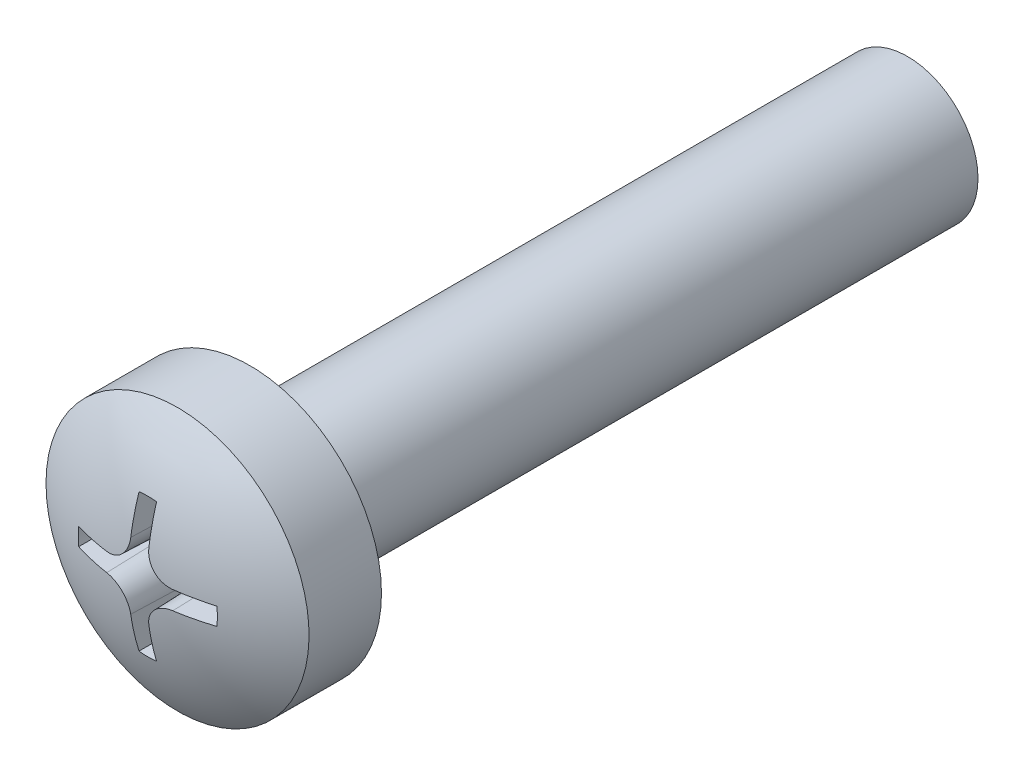
ISO-10303-21;
HEADER;
FILE_DESCRIPTION(('STEP AP214'),'2;1');
FILE_NAME('part.step','',(''),(''),'','','');
FILE_SCHEMA(('AUTOMOTIVE_DESIGN { 1 0 10303 214 1 1 1 1 }'));
ENDSEC;
DATA;
#1=APPLICATION_CONTEXT('core data for automotive mechanical design processes');
#2=APPLICATION_PROTOCOL_DEFINITION('international standard','automotive_design',2000,#1);
#3=PRODUCT_CONTEXT('',#1,'mechanical');
#4=PRODUCT('Part','Part','',(#3));
#5=PRODUCT_RELATED_PRODUCT_CATEGORY('part','',(#4));
#6=PRODUCT_DEFINITION_FORMATION('','',#4);
#7=PRODUCT_DEFINITION_CONTEXT('part definition',#1,'design');
#8=PRODUCT_DEFINITION('design','',#6,#7);
#9=PRODUCT_DEFINITION_SHAPE('','',#8);
#10=(LENGTH_UNIT() NAMED_UNIT(*) SI_UNIT(.MILLI.,.METRE.));
#11=(NAMED_UNIT(*) PLANE_ANGLE_UNIT() SI_UNIT($,.RADIAN.));
#12=(NAMED_UNIT(*) SI_UNIT($,.STERADIAN.) SOLID_ANGLE_UNIT());
#13=UNCERTAINTY_MEASURE_WITH_UNIT(LENGTH_MEASURE(1.E-05),#10,'distance_accuracy_value','');
#14=(GEOMETRIC_REPRESENTATION_CONTEXT(3) GLOBAL_UNCERTAINTY_ASSIGNED_CONTEXT((#13)) GLOBAL_UNIT_ASSIGNED_CONTEXT((#10,
#11,#12)) REPRESENTATION_CONTEXT('',''));
#15=CARTESIAN_POINT('',(0.,0.,0.));
#16=DIRECTION('',(0.,0.,1.));
#17=DIRECTION('',(1.,0.,0.));
#18=AXIS2_PLACEMENT_3D('',#15,#16,#17);
#19=CARTESIAN_POINT('',(0.,0.,14.));
#20=DIRECTION('',(0.,0.,-1.));
#21=DIRECTION('',(-1.,0.,0.));
#22=AXIS2_PLACEMENT_3D('',#19,#20,#21);
#23=CYLINDRICAL_SURFACE('',#22,1.5);
#24=CARTESIAN_POINT('',(0.,0.,14.));
#25=DIRECTION('',(0.,0.,1.));
#26=DIRECTION('',(1.,0.,0.));
#27=AXIS2_PLACEMENT_3D('',#24,#25,#26);
#28=CIRCLE('',#27,1.5);
#29=CARTESIAN_POINT('',(1.5,0.,14.));
#30=VERTEX_POINT('',#29);
#31=EDGE_CURVE('E206',#30,#30,#28,.T.);
#32=ORIENTED_EDGE('',*,*,#31,.F.);
#33=EDGE_LOOP('',(#32));
#34=FACE_BOUND('',#33,.T.);
#35=CARTESIAN_POINT('',(0.,0.,0.));
#36=DIRECTION('',(0.,0.,1.));
#37=DIRECTION('',(1.,0.,0.));
#38=AXIS2_PLACEMENT_3D('',#35,#36,#37);
#39=CIRCLE('',#38,1.5);
#40=CARTESIAN_POINT('',(1.5,0.,0.));
#41=VERTEX_POINT('',#40);
#42=EDGE_CURVE('E205',#41,#41,#39,.T.);
#43=ORIENTED_EDGE('',*,*,#42,.T.);
#44=EDGE_LOOP('',(#43));
#45=FACE_BOUND('',#44,.T.);
#46=ADVANCED_FACE('F34',(#34,#45),#23,.T.);
#47=CARTESIAN_POINT('',(0.,0.,0.));
#48=DIRECTION('',(0.,0.,1.));
#49=DIRECTION('',(1.,0.,0.));
#50=AXIS2_PLACEMENT_3D('',#47,#48,#49);
#51=PLANE('',#50);
#52=ORIENTED_EDGE('',*,*,#42,.F.);
#53=EDGE_LOOP('',(#52));
#54=FACE_BOUND('',#53,.T.);
#55=ADVANCED_FACE('F291',(#54),#51,.F.);
#56=CARTESIAN_POINT('',(0.,0.,14.));
#57=DIRECTION('',(0.,0.,-1.));
#58=DIRECTION('',(-1.,0.,0.));
#59=AXIS2_PLACEMENT_3D('',#56,#57,#58);
#60=PLANE('',#59);
#61=CARTESIAN_POINT('',(0.,0.,14.));
#62=DIRECTION('',(0.,0.,-1.));
#63=DIRECTION('',(-1.,0.,0.));
#64=AXIS2_PLACEMENT_3D('',#61,#62,#63);
#65=CIRCLE('',#64,2.79999990016222);
#66=CARTESIAN_POINT('',(-2.79999990016222,0.,14.));
#67=VERTEX_POINT('',#66);
#68=EDGE_CURVE('E202',#67,#67,#65,.T.);
#69=ORIENTED_EDGE('',*,*,#68,.T.);
#70=EDGE_LOOP('',(#69));
#71=FACE_BOUND('',#70,.T.);
#72=ORIENTED_EDGE('',*,*,#31,.T.);
#73=EDGE_LOOP('',(#72));
#74=FACE_BOUND('',#73,.T.);
#75=ADVANCED_FACE('F296',(#71,#74),#60,.T.);
#76=CARTESIAN_POINT('',(0.,0.,-0.393620134621003));
#77=DIRECTION('',(0.,0.,-1.));
#78=DIRECTION('',(-1.,0.,0.));
#79=AXIS2_PLACEMENT_3D('',#76,#77,#78);
#80=CYLINDRICAL_SURFACE('',#79,2.79999990016222);
#81=CARTESIAN_POINT('',(0.,0.,15.5424630797893));
#82=DIRECTION('',(0.,0.,-1.));
#83=DIRECTION('',(-1.,0.,0.));
#84=AXIS2_PLACEMENT_3D('',#81,#82,#83);
#85=CIRCLE('',#84,2.79999990016222);
#86=CARTESIAN_POINT('',(-2.79999990016222,0.,15.5424630797893));
#87=VERTEX_POINT('',#86);
#88=EDGE_CURVE('E150',#87,#87,#85,.T.);
#89=ORIENTED_EDGE('',*,*,#88,.T.);
#90=EDGE_LOOP('',(#89));
#91=FACE_BOUND('',#90,.T.);
#92=ORIENTED_EDGE('',*,*,#68,.F.);
#93=EDGE_LOOP('',(#92));
#94=FACE_BOUND('',#93,.T.);
#95=ADVANCED_FACE('F303',(#91,#94),#80,.T.);
#96=CARTESIAN_POINT('',(0.,0.,11.4000001117587));
#97=DIRECTION('',(0.,0.,-1.));
#98=DIRECTION('',(1.,0.,0.));
#99=AXIS2_PLACEMENT_3D('',#96,#97,#98);
#100=SPHERICAL_SURFACE('',#99,4.99999988824129);
#101=CARTESIAN_POINT('',(0.,0.,16.1754183821502));
#102=DIRECTION('',(0.,0.,-1.));
#103=DIRECTION('',(-1.,0.,0.));
#104=AXIS2_PLACEMENT_3D('',#101,#102,#103);
#105=CIRCLE('',#104,1.4816812157899);
#106=CARTESIAN_POINT('',(0.18668120666759,1.46987392394782,16.1754183821501));
#107=VERTEX_POINT('',#106);
#108=CARTESIAN_POINT('',(-0.186681206667593,1.46987392394782,16.1754183821501));
#109=VERTEX_POINT('',#108);
#110=EDGE_CURVE('E11',#107,#109,#105,.F.);
#111=ORIENTED_EDGE('',*,*,#110,.F.);
#112=CARTESIAN_POINT('',(0.0198956640512634,0.,11.3993053398605));
#113=DIRECTION('',(0.999390827019096,0.,-0.034899496702501));
#114=DIRECTION('',(-0.034899496702501,0.,-0.999390827019096));
#115=AXIS2_PLACEMENT_3D('',#112,#113,#114);
#116=CIRCLE('',#115,4.99996025606773);
#117=CARTESIAN_POINT('',(0.192632610704328,0.708178557647151,16.3458442955351));
#118=VERTEX_POINT('',#117);
#119=EDGE_CURVE('E41',#107,#118,#116,.T.);
#120=ORIENTED_EDGE('',*,*,#119,.T.);
#121=CARTESIAN_POINT('',(0.192631650862954,0.708378557647151,16.345815691475));
#122=CARTESIAN_POINT('',(0.192737639690806,0.679822741796073,16.3499041439734));
#123=CARTESIAN_POINT('',(0.195268867839181,0.651227392830895,16.3536463362414));
#124=CARTESIAN_POINT('',(0.205046889209158,0.594767038274589,16.3603460551712));
#125=CARTESIAN_POINT('',(0.212292618678018,0.566901869404939,16.3633037586285));
#126=CARTESIAN_POINT('',(0.231373694375068,0.51267267841366,16.3683466063254));
#127=CARTESIAN_POINT('',(0.24321326807329,0.486310064716558,16.3704309431667));
#128=CARTESIAN_POINT('',(0.271156607880554,0.435900324544808,16.3736603491012));
#129=CARTESIAN_POINT('',(0.287258672100205,0.411852279143785,16.3748057923215));
#130=CARTESIAN_POINT('',(0.323072075489886,0.367028886470805,16.3761158025717));
#131=CARTESIAN_POINT('',(0.342740648168189,0.346219679514825,16.3762912893596));
#132=CARTESIAN_POINT('',(0.385246757538769,0.308146709447779,16.3756853456951));
#133=CARTESIAN_POINT('',(0.408084792807393,0.290883505206881,16.3749037645383));
#134=CARTESIAN_POINT('',(0.456147210008962,0.260464262414973,16.3724133951705));
#135=CARTESIAN_POINT('',(0.481359759209806,0.247289131136678,16.3707090224733));
#136=CARTESIAN_POINT('',(0.533541444049374,0.225283958921734,16.3664258870809));
#137=CARTESIAN_POINT('',(0.560509920861878,0.216452298826715,16.3638474508254));
#138=CARTESIAN_POINT('',(0.606876295057339,0.205379627868596,16.3588207651558));
#139=CARTESIAN_POINT('',(0.626020977094075,0.201943221890058,16.3565812960749));
#140=CARTESIAN_POINT('',(0.664502044043211,0.197253494550335,16.3517582366185));
#141=CARTESIAN_POINT('',(0.683838077649067,0.195996727127303,16.349175196413));
#142=CARTESIAN_POINT('',(0.703167546290468,0.195835015722445,16.3464334662955));
#143=B_SPLINE_CURVE_WITH_KNOTS('',3,(#121,#122,#123,#124,#125,#126,#127,#128,#129,#130,#131,
#132,#133,#134,#135,#136,#137,#138,#139,#140,#141,#142),.UNSPECIFIED.,.F.,.F.,(4,2,2,2,2,2,2,2,
2,2,4),(0.,0.0864417829586746,0.172864068455127,0.259366073122685,0.34583359199461,
0.43132564691208,0.516831165542017,0.601931114274005,0.686999315371811,0.745618262708562,
0.804144447281415),.UNSPECIFIED.);
#144=CARTESIAN_POINT('',(0.702917362553185,0.19583721033533,16.3464689381926));
#145=VERTEX_POINT('',#144);
#146=EDGE_CURVE('E274',#118,#145,#143,.T.);
#147=ORIENTED_EDGE('',*,*,#146,.T.);
#148=CARTESIAN_POINT('',(0.00010539015335094,0.0259265633149155,11.3990947287374));
#149=DIRECTION('',(0.00406243901494415,0.999382570249833,-0.034899496702501));
#150=DIRECTION('',(0.,0.0348997846864301,0.999390816962434));
#151=AXIS2_PLACEMENT_3D('',#148,#149,#150);
#152=CIRCLE('',#151,4.99993258603575);
#153=CARTESIAN_POINT('',(1.46986565043204,0.186746338396853,16.1754183821502));
#154=VERTEX_POINT('',#153);
#155=EDGE_CURVE('E272',#154,#145,#152,.F.);
#156=ORIENTED_EDGE('',*,*,#155,.F.);
#157=CARTESIAN_POINT('',(0.,0.,16.1754183821502));
#158=DIRECTION('',(0.,0.,-1.));
#159=DIRECTION('',(-1.,0.,0.));
#160=AXIS2_PLACEMENT_3D('',#157,#158,#159);
#161=CIRCLE('',#160,1.4816812157899);
#162=CARTESIAN_POINT('',(1.46986565043204,-0.186746338396852,16.1754183821501));
#163=VERTEX_POINT('',#162);
#164=EDGE_CURVE('E270',#163,#154,#161,.F.);
#165=ORIENTED_EDGE('',*,*,#164,.F.);
#166=CARTESIAN_POINT('',(0.000105390153350971,-0.025926563314917,11.3990947287374));
#167=DIRECTION('',(0.00406243901494512,-0.999382570249833,-0.034899496702501));
#168=DIRECTION('',(0.,0.0348997846864301,-0.999390816962434));
#169=AXIS2_PLACEMENT_3D('',#166,#167,#168);
#170=CIRCLE('',#169,4.99993258603575);
#171=CARTESIAN_POINT('',(0.702917362553185,-0.195837210335333,16.3464689381927));
#172=VERTEX_POINT('',#171);
#173=EDGE_CURVE('E267',#163,#172,#170,.T.);
#174=ORIENTED_EDGE('',*,*,#173,.T.);
#175=CARTESIAN_POINT('',(0.192631650862954,-0.708378557647151,16.345815691475));
#176=CARTESIAN_POINT('',(0.192737639690806,-0.679822741796074,16.3499041439734));
#177=CARTESIAN_POINT('',(0.195268867839181,-0.651227392830896,16.3536463362414));
#178=CARTESIAN_POINT('',(0.205046889209158,-0.59476703827459,16.3603460551712));
#179=CARTESIAN_POINT('',(0.212292618678018,-0.56690186940494,16.3633037586285));
#180=CARTESIAN_POINT('',(0.231373694375068,-0.512672678413661,16.3683466063254));
#181=CARTESIAN_POINT('',(0.24321326807329,-0.486310064716559,16.3704309431667));
#182=CARTESIAN_POINT('',(0.271156607880554,-0.435900324544809,16.3736603491012));
#183=CARTESIAN_POINT('',(0.287258672100205,-0.411852279143786,16.3748057923215));
#184=CARTESIAN_POINT('',(0.323072075489886,-0.367028886470806,16.3761158025717));
#185=CARTESIAN_POINT('',(0.342740648168188,-0.346219679514826,16.3762912893596));
#186=CARTESIAN_POINT('',(0.385246757538768,-0.30814670944778,16.3756853456951));
#187=CARTESIAN_POINT('',(0.408084792807393,-0.290883505206882,16.3749037645383));
#188=CARTESIAN_POINT('',(0.456147210008962,-0.260464262414974,16.3724133951705));
#189=CARTESIAN_POINT('',(0.481359759209805,-0.247289131136679,16.3707090224733));
#190=CARTESIAN_POINT('',(0.533541444049374,-0.225283958921735,16.3664258870809));
#191=CARTESIAN_POINT('',(0.560509920861878,-0.216452298826716,16.3638474508254));
#192=CARTESIAN_POINT('',(0.606876295057339,-0.205379627868597,16.3588207651558));
#193=CARTESIAN_POINT('',(0.626020977094075,-0.201943221890059,16.3565812960749));
#194=CARTESIAN_POINT('',(0.664502044043211,-0.197253494550336,16.3517582366185));
#195=CARTESIAN_POINT('',(0.683838077649067,-0.195996727127304,16.349175196413));
#196=CARTESIAN_POINT('',(0.703167546290467,-0.195835015722445,16.3464334662955));
#197=B_SPLINE_CURVE_WITH_KNOTS('',3,(#175,#176,#177,#178,#179,#180,#181,#182,#183,#184,#185,
#186,#187,#188,#189,#190,#191,#192,#193,#194,#195,#196),.UNSPECIFIED.,.F.,.F.,(4,2,2,2,2,2,2,2,
2,2,4),(0.,0.0864417829586745,0.172864068455127,0.259366073122685,0.34583359199461,
0.43132564691208,0.516831165542017,0.601931114274005,0.686999315371811,0.745618262708562,
0.804144447281414),.UNSPECIFIED.);
#198=CARTESIAN_POINT('',(0.192632610704328,-0.708178557647152,16.3458442955351));
#199=VERTEX_POINT('',#198);
#200=EDGE_CURVE('E262',#199,#172,#197,.T.);
#201=ORIENTED_EDGE('',*,*,#200,.F.);
#202=CARTESIAN_POINT('',(0.0198956640512634,0.,11.3993053398605));
#203=DIRECTION('',(0.999390827019096,0.,-0.034899496702501));
#204=DIRECTION('',(-0.034899496702501,0.,-0.999390827019096));
#205=AXIS2_PLACEMENT_3D('',#202,#203,#204);
#206=CIRCLE('',#205,4.99996025606773);
#207=CARTESIAN_POINT('',(0.186681206667592,-1.46987392394782,16.1754183821502));
#208=VERTEX_POINT('',#207);
#209=EDGE_CURVE('E260',#208,#199,#206,.F.);
#210=ORIENTED_EDGE('',*,*,#209,.F.);
#211=CARTESIAN_POINT('',(0.,0.,16.1754183821502));
#212=DIRECTION('',(0.,0.,-1.));
#213=DIRECTION('',(-1.,0.,0.));
#214=AXIS2_PLACEMENT_3D('',#211,#212,#213);
#215=CIRCLE('',#214,1.4816812157899);
#216=CARTESIAN_POINT('',(-0.186681206667593,-1.46987392394782,16.1754183821501));
#217=VERTEX_POINT('',#216);
#218=EDGE_CURVE('E257',#208,#217,#215,.T.);
#219=ORIENTED_EDGE('',*,*,#218,.T.);
#220=CARTESIAN_POINT('',(-0.0198956640512655,0.,11.3993053398605));
#221=DIRECTION('',(-0.999390827019096,0.,-0.034899496702501));
#222=DIRECTION('',(-0.034899496702501,0.,0.999390827019096));
#223=AXIS2_PLACEMENT_3D('',#220,#221,#222);
#224=CIRCLE('',#223,4.99996025606773);
#225=CARTESIAN_POINT('',(-0.19263261070433,-0.708178557647151,16.3458442955351));
#226=VERTEX_POINT('',#225);
#227=EDGE_CURVE('E253',#217,#226,#224,.T.);
#228=ORIENTED_EDGE('',*,*,#227,.T.);
#229=CARTESIAN_POINT('',(-0.70316754629047,-0.195835015722445,16.3464334662955));
#230=CARTESIAN_POINT('',(-0.674619447950853,-0.196052963217916,16.3504857241648));
#231=CARTESIAN_POINT('',(-0.646041434637229,-0.198695168407334,16.3541890416191));
#232=CARTESIAN_POINT('',(-0.589634494727846,-0.208689654905481,16.3608068014756));
#233=CARTESIAN_POINT('',(-0.561805393198953,-0.216040826152062,16.3637214295682));
#234=CARTESIAN_POINT('',(-0.507666120821231,-0.235323893103952,16.3686750861046));
#235=CARTESIAN_POINT('',(-0.481357369172765,-0.247259991703852,16.370713307523));
#236=CARTESIAN_POINT('',(-0.431071022991569,-0.275383990623326,16.3738489099634));
#237=CARTESIAN_POINT('',(-0.407092510169896,-0.291570206692358,16.3749466629444));
#238=CARTESIAN_POINT('',(-0.362416703115868,-0.327538701485094,16.3761618083202));
#239=CARTESIAN_POINT('',(-0.341685887352751,-0.347278991317758,16.376289966384));
#240=CARTESIAN_POINT('',(-0.303780328011578,-0.389912448398921,16.3755903647161));
#241=CARTESIAN_POINT('',(-0.286606147147997,-0.412806113607387,16.3747624538554));
#242=CARTESIAN_POINT('',(-0.256366858084051,-0.460969475916928,16.3721816258056));
#243=CARTESIAN_POINT('',(-0.243283863198687,-0.486228184526671,16.3704328274806));
#244=CARTESIAN_POINT('',(-0.22146899790456,-0.538485231439467,16.366063898297));
#245=CARTESIAN_POINT('',(-0.212735526227358,-0.565482925398504,16.3634440886927));
#246=CARTESIAN_POINT('',(-0.201823996880683,-0.611913615273529,16.3583478129874));
#247=CARTESIAN_POINT('',(-0.198453223120025,-0.631098599357624,16.3560784464194));
#248=CARTESIAN_POINT('',(-0.193901764340931,-0.669652448873598,16.3511968730386));
#249=CARTESIAN_POINT('',(-0.192717622166764,-0.689020975292662,16.3485852144187));
#250=CARTESIAN_POINT('',(-0.192631650862956,-0.708378557647151,16.345815691475));
#251=B_SPLINE_CURVE_WITH_KNOTS('',3,(#229,#230,#231,#232,#233,#234,#235,#236,#237,#238,#239,
#240,#241,#242,#243,#244,#245,#246,#247,#248,#249,#250),.UNSPECIFIED.,.F.,.F.,(4,2,2,2,2,2,2,2,
2,2,4),(0.,0.0864053436114191,0.172790326060609,0.259254685287908,0.345684831711329,
0.431153892876566,0.516636466251359,0.601739908197795,0.686811996276177,0.745524819849982,
0.804144736260156),.UNSPECIFIED.);
#252=CARTESIAN_POINT('',(-0.702917362553187,-0.195837210335331,16.3464689381926));
#253=VERTEX_POINT('',#252);
#254=EDGE_CURVE('E247',#253,#226,#251,.T.);
#255=ORIENTED_EDGE('',*,*,#254,.F.);
#256=CARTESIAN_POINT('',(-0.000105390153349066,-0.0259265633149169,11.3990947287374));
#257=DIRECTION('',(-0.0040624390149453,-0.999382570249833,-0.034899496702501));
#258=DIRECTION('',(0.,0.0348997846864301,-0.999390816962434));
#259=AXIS2_PLACEMENT_3D('',#256,#257,#258);
#260=CIRCLE('',#259,4.99993258603575);
#261=CARTESIAN_POINT('',(-1.46986565043204,-0.186746338396853,16.1754183821502));
#262=VERTEX_POINT('',#261);
#263=EDGE_CURVE('E254',#262,#253,#260,.F.);
#264=ORIENTED_EDGE('',*,*,#263,.F.);
#265=CARTESIAN_POINT('',(0.,0.,16.1754183821502));
#266=DIRECTION('',(0.,0.,-1.));
#267=DIRECTION('',(-1.,0.,0.));
#268=AXIS2_PLACEMENT_3D('',#265,#266,#267);
#269=CIRCLE('',#268,1.4816812157899);
#270=CARTESIAN_POINT('',(-1.46986565043204,0.186746338396852,16.1754183821501));
#271=VERTEX_POINT('',#270);
#272=EDGE_CURVE('E582',#262,#271,#269,.T.);
#273=ORIENTED_EDGE('',*,*,#272,.T.);
#274=CARTESIAN_POINT('',(-0.000105390153349066,0.0259265633149169,11.3990947287374));
#275=DIRECTION('',(-0.00406243901494529,0.999382570249833,-0.034899496702501));
#276=DIRECTION('',(0.,0.0348997846864301,0.999390816962434));
#277=AXIS2_PLACEMENT_3D('',#274,#275,#276);
#278=CIRCLE('',#277,4.99993258603575);
#279=CARTESIAN_POINT('',(-0.702917362553187,0.195837210335333,16.3464689381927));
#280=VERTEX_POINT('',#279);
#281=EDGE_CURVE('E220',#271,#280,#278,.T.);
#282=ORIENTED_EDGE('',*,*,#281,.T.);
#283=CARTESIAN_POINT('',(-0.192631650862955,0.708378557647151,16.345815691475));
#284=CARTESIAN_POINT('',(-0.192737639690808,0.679822741796073,16.3499041439734));
#285=CARTESIAN_POINT('',(-0.195268867839183,0.651227392830895,16.3536463362414));
#286=CARTESIAN_POINT('',(-0.20504688920916,0.594767038274589,16.3603460551712));
#287=CARTESIAN_POINT('',(-0.21229261867802,0.566901869404939,16.3633037586285));
#288=CARTESIAN_POINT('',(-0.23137369437507,0.51267267841366,16.3683466063254));
#289=CARTESIAN_POINT('',(-0.243213268073292,0.486310064716558,16.3704309431667));
#290=CARTESIAN_POINT('',(-0.271156607880556,0.435900324544808,16.3736603491012));
#291=CARTESIAN_POINT('',(-0.287258672100207,0.411852279143785,16.3748057923215));
#292=CARTESIAN_POINT('',(-0.323072075489888,0.367028886470806,16.3761158025717));
#293=CARTESIAN_POINT('',(-0.34274064816819,0.346219679514825,16.3762912893596));
#294=CARTESIAN_POINT('',(-0.38524675753877,0.30814670944778,16.3756853456951));
#295=CARTESIAN_POINT('',(-0.408084792807394,0.290883505206881,16.3749037645383));
#296=CARTESIAN_POINT('',(-0.456147210008964,0.260464262414973,16.3724133951705));
#297=CARTESIAN_POINT('',(-0.481359759209807,0.247289131136679,16.3707090224733));
#298=CARTESIAN_POINT('',(-0.533541444049376,0.225283958921734,16.3664258870809));
#299=CARTESIAN_POINT('',(-0.56050992086188,0.216452298826716,16.3638474508254));
#300=CARTESIAN_POINT('',(-0.606876295057341,0.205379627868597,16.3588207651558));
#301=CARTESIAN_POINT('',(-0.626020977094077,0.201943221890059,16.3565812960749));
#302=CARTESIAN_POINT('',(-0.664502044043212,0.197253494550336,16.3517582366185));
#303=CARTESIAN_POINT('',(-0.683838077649069,0.195996727127304,16.349175196413));
#304=CARTESIAN_POINT('',(-0.703167546290469,0.195835015722445,16.3464334662955));
#305=B_SPLINE_CURVE_WITH_KNOTS('',3,(#283,#284,#285,#286,#287,#288,#289,#290,#291,#292,#293,
#294,#295,#296,#297,#298,#299,#300,#301,#302,#303,#304),.UNSPECIFIED.,.F.,.F.,(4,2,2,2,2,2,2,2,
2,2,4),(0.,0.0864417829586746,0.172864068455127,0.259366073122685,0.34583359199461,
0.43132564691208,0.516831165542017,0.601931114274005,0.686999315371811,0.745618262708562,
0.804144447281414),.UNSPECIFIED.);
#306=CARTESIAN_POINT('',(-0.19263261070433,0.708178557647151,16.3458442955351));
#307=VERTEX_POINT('',#306);
#308=EDGE_CURVE('E213',#307,#280,#305,.T.);
#309=ORIENTED_EDGE('',*,*,#308,.F.);
#310=CARTESIAN_POINT('',(-0.0198956640512645,0.,11.3993053398605));
#311=DIRECTION('',(-0.999390827019096,0.,-0.034899496702501));
#312=DIRECTION('',(-0.034899496702501,0.,0.999390827019096));
#313=AXIS2_PLACEMENT_3D('',#310,#311,#312);
#314=CIRCLE('',#313,4.99996025606773);
#315=EDGE_CURVE('E209',#109,#307,#314,.F.);
#316=ORIENTED_EDGE('',*,*,#315,.F.);
#317=EDGE_LOOP('',(#111,#120,#147,#156,#165,#174,#201,#210,#219,#228,#255,#264,#273,#282,#309,#316));
#318=FACE_BOUND('',#317,.T.);
#319=ORIENTED_EDGE('',*,*,#88,.F.);
#320=EDGE_LOOP('',(#319));
#321=FACE_BOUND('',#320,.T.);
#322=ADVANCED_FACE('F222',(#318,#321),#100,.T.);
#323=CARTESIAN_POINT('',(0.,0.,16.7000001));
#324=DIRECTION('',(0.,0.,1.));
#325=DIRECTION('',(1.,0.,0.));
#326=AXIS2_PLACEMENT_3D('',#323,#324,#325);
#327=CONICAL_SURFACE('',#326,1.50000001303852,0.0349065850398867);
#328=ORIENTED_EDGE('',*,*,#110,.T.);
#329=CARTESIAN_POINT('',(-0.142142619910814,1.43009594495933,14.9000001309199));
#330=CARTESIAN_POINT('',(-0.152618658076336,1.43957885994155,15.1999946132293));
#331=CARTESIAN_POINT('',(-0.163094792502732,1.4489727928664,15.4999918520894));
#332=CARTESIAN_POINT('',(-0.184047253837866,1.46758269456637,16.0999918417828));
#333=CARTESIAN_POINT('',(-0.194523580746602,1.47679866334215,16.399994592616));
#334=CARTESIAN_POINT('',(-0.205000003916213,1.48592565006124,16.7000001));
#335=B_SPLINE_CURVE_WITH_KNOTS('',3,(#329,#330,#331,#332,#333,#334),.UNSPECIFIED.,.F.,.F.,(4,2,
4),(0.,0.900981158642232,1.80196231389533),.UNSPECIFIED.);
#336=CARTESIAN_POINT('',(-0.142142619910814,1.43009594495933,14.9000001309199));
#337=VERTEX_POINT('',#336);
#338=EDGE_CURVE('E48',#337,#109,#335,.T.);
#339=ORIENTED_EDGE('',*,*,#338,.F.);
#340=CARTESIAN_POINT('',(0.,0.,14.9000001309199));
#341=DIRECTION('',(0.,0.,1.));
#342=DIRECTION('',(1.,0.,0.));
#343=AXIS2_PLACEMENT_3D('',#340,#341,#342);
#344=CIRCLE('',#343,1.43714262903312);
#345=CARTESIAN_POINT('',(0.142142619910811,1.43009594495933,14.9000001309199));
#346=VERTEX_POINT('',#345);
#347=EDGE_CURVE('E158',#346,#337,#344,.T.);
#348=ORIENTED_EDGE('',*,*,#347,.F.);
#349=CARTESIAN_POINT('',(0.142142619910811,1.43009594495933,14.9000001309199));
#350=CARTESIAN_POINT('',(0.152618658076333,1.43957885994155,15.1999946132293));
#351=CARTESIAN_POINT('',(0.16309479250273,1.4489727928664,15.4999918520894));
#352=CARTESIAN_POINT('',(0.184047253837863,1.46758269456637,16.0999918417828));
#353=CARTESIAN_POINT('',(0.1945235807466,1.47679866334215,16.399994592616));
#354=CARTESIAN_POINT('',(0.205000003916211,1.48592565006124,16.7000001));
#355=B_SPLINE_CURVE_WITH_KNOTS('',3,(#349,#350,#351,#352,#353,#354),.UNSPECIFIED.,.F.,.F.,(4,2,
4),(0.,0.900981158642232,1.80196231389533),.UNSPECIFIED.);
#356=EDGE_CURVE('E142',#346,#107,#355,.T.);
#357=ORIENTED_EDGE('',*,*,#356,.T.);
#358=EDGE_LOOP('',(#328,#339,#348,#357));
#359=FACE_BOUND('',#358,.T.);
#360=ADVANCED_FACE('F162',(#359),#327,.F.);
#361=CARTESIAN_POINT('',(0.205000003916211,1.48592565006124,16.7000001));
#362=DIRECTION('',(0.999390827019096,0.,-0.034899496702501));
#363=DIRECTION('',(-0.034899496702501,0.,-0.999390827019096));
#364=AXIS2_PLACEMENT_3D('',#361,#362,#363);
#365=PLANE('',#364);
#366=ORIENTED_EDGE('',*,*,#356,.F.);
#367=DIRECTION('',(0.,1.,0.));
#368=VECTOR('',#367,1.);
#369=CARTESIAN_POINT('',(0.142142619910812,0.,14.9000001309199));
#370=LINE('',#369,#368);
#371=CARTESIAN_POINT('',(0.142142619910811,0.708178557647151,14.9000001309199));
#372=VERTEX_POINT('',#371);
#373=EDGE_CURVE('E145',#346,#372,#370,.F.);
#374=ORIENTED_EDGE('',*,*,#373,.T.);
#375=DIRECTION('',(0.034899496702501,0.,0.999390827019096));
#376=VECTOR('',#375,1.);
#377=CARTESIAN_POINT('',(0.20500000391621,0.708178557647151,16.7000001));
#378=LINE('',#377,#376);
#379=EDGE_CURVE('E151',#372,#118,#378,.T.);
#380=ORIENTED_EDGE('',*,*,#379,.T.);
#381=ORIENTED_EDGE('',*,*,#119,.F.);
#382=EDGE_LOOP('',(#366,#374,#380,#381));
#383=FACE_BOUND('',#382,.T.);
#384=ADVANCED_FACE('F144',(#383),#365,.F.);
#385=CARTESIAN_POINT('',(0.705000003916211,0.708178557647151,16.7000001));
#386=DIRECTION('',(0.,0.,-1.));
#387=DIRECTION('',(1.,0.,0.));
#388=AXIS2_PLACEMENT_3D('',#385,#386,#387);
#389=CONICAL_SURFACE('',#388,0.5,0.0349065850398867);
#390=ORIENTED_EDGE('',*,*,#379,.F.);
#391=CARTESIAN_POINT('',(0.705000003916211,0.708178557647151,14.9000001309199));
#392=DIRECTION('',(0.,0.,1.));
#393=DIRECTION('',(1.,0.,0.));
#394=AXIS2_PLACEMENT_3D('',#391,#392,#393);
#395=CIRCLE('',#394,0.562857384005399);
#396=CARTESIAN_POINT('',(0.702712036351556,0.145325823858085,14.9000001309199));
#397=VERTEX_POINT('',#396);
#398=EDGE_CURVE('E160',#372,#397,#395,.T.);
#399=ORIENTED_EDGE('',*,*,#398,.T.);
#400=DIRECTION('',(0.000141863496415148,0.0348992083697649,0.999390827019096));
#401=VECTOR('',#400,1.);
#402=CARTESIAN_POINT('',(0.702967546290468,0.208182688548215,16.7000001));
#403=LINE('',#402,#401);
#404=EDGE_CURVE('E409',#397,#145,#403,.T.);
#405=ORIENTED_EDGE('',*,*,#404,.T.);
#406=ORIENTED_EDGE('',*,*,#146,.F.);
#407=EDGE_LOOP('',(#390,#399,#405,#406));
#408=FACE_BOUND('',#407,.T.);
#409=ADVANCED_FACE('F279',(#408),#389,.T.);
#410=CARTESIAN_POINT('',(1.48592565006123,0.205000003916213,16.7000001));
#411=DIRECTION('',(0.00406243901494415,0.999382570249833,-0.034899496702501));
#412=DIRECTION('',(0.,0.0348997846864301,0.999390816962434));
#413=AXIS2_PLACEMENT_3D('',#410,#411,#412);
#414=PLANE('',#413);
#415=ORIENTED_EDGE('',*,*,#155,.T.);
#416=ORIENTED_EDGE('',*,*,#404,.F.);
#417=DIRECTION('',(-0.99999173819787,0.00406491525148502,0.));
#418=VECTOR('',#417,1.);
#419=CARTESIAN_POINT('',(0.000602343564913371,0.148179863836023,14.9000001309199));
#420=LINE('',#419,#418);
#421=CARTESIAN_POINT('',(1.43007341244828,0.142369137079488,14.9000001309199));
#422=VERTEX_POINT('',#421);
#423=EDGE_CURVE('E171',#422,#397,#420,.T.);
#424=ORIENTED_EDGE('',*,*,#423,.F.);
#425=CARTESIAN_POINT('',(1.43007341244828,0.142369137079488,14.9000001309199));
#426=CARTESIAN_POINT('',(1.43955869120937,0.152806706922151,15.1999946790441));
#427=CARTESIAN_POINT('',(1.44895568373278,0.163244730756208,15.4999919508073));
#428=CARTESIAN_POINT('',(1.46757309626977,0.184121686368453,16.0999919405007));
#429=CARTESIAN_POINT('',(1.47679351628402,0.194560618146638,16.3999946584309));
#430=CARTESIAN_POINT('',(1.48592565006123,0.205000003916213,16.7000001));
#431=B_SPLINE_CURVE_WITH_KNOTS('',3,(#425,#426,#427,#428,#429,#430),.UNSPECIFIED.,.F.,.F.,(4,2,
4),(0.,0.900977563471273,1.80195512360615),.UNSPECIFIED.);
#432=EDGE_CURVE('E404',#422,#154,#431,.T.);
#433=ORIENTED_EDGE('',*,*,#432,.T.);
#434=EDGE_LOOP('',(#415,#416,#424,#433));
#435=FACE_BOUND('',#434,.T.);
#436=ADVANCED_FACE('F234',(#435),#414,.F.);
#437=CARTESIAN_POINT('',(0.,0.,16.7000001));
#438=DIRECTION('',(0.,0.,1.));
#439=DIRECTION('',(1.,0.,0.));
#440=AXIS2_PLACEMENT_3D('',#437,#438,#439);
#441=CONICAL_SURFACE('',#440,1.50000001303852,0.0349065850398867);
#442=ORIENTED_EDGE('',*,*,#164,.T.);
#443=ORIENTED_EDGE('',*,*,#432,.F.);
#444=CARTESIAN_POINT('',(0.,0.,14.9000001309199));
#445=DIRECTION('',(0.,0.,1.));
#446=DIRECTION('',(1.,0.,0.));
#447=AXIS2_PLACEMENT_3D('',#444,#445,#446);
#448=CIRCLE('',#447,1.43714262903312);
#449=CARTESIAN_POINT('',(1.43007341244828,-0.142369137079488,14.9000001309199));
#450=VERTEX_POINT('',#449);
#451=EDGE_CURVE('E173',#450,#422,#448,.T.);
#452=ORIENTED_EDGE('',*,*,#451,.F.);
#453=CARTESIAN_POINT('',(1.43007341244828,-0.142369137079488,14.9000001309199));
#454=CARTESIAN_POINT('',(1.43955869120937,-0.152806706922151,15.1999946790441));
#455=CARTESIAN_POINT('',(1.44895568373278,-0.163244730756208,15.4999919508073));
#456=CARTESIAN_POINT('',(1.46757309626977,-0.184121686368453,16.0999919405007));
#457=CARTESIAN_POINT('',(1.47679351628402,-0.194560618146638,16.3999946584309));
#458=CARTESIAN_POINT('',(1.48592565006123,-0.205000003916213,16.7000001));
#459=B_SPLINE_CURVE_WITH_KNOTS('',3,(#453,#454,#455,#456,#457,#458),.UNSPECIFIED.,.F.,.F.,(4,2,
4),(0.,0.900977563471273,1.80195512360615),.UNSPECIFIED.);
#460=EDGE_CURVE('E399',#450,#163,#459,.T.);
#461=ORIENTED_EDGE('',*,*,#460,.T.);
#462=EDGE_LOOP('',(#442,#443,#452,#461));
#463=FACE_BOUND('',#462,.T.);
#464=ADVANCED_FACE('F287',(#463),#441,.F.);
#465=CARTESIAN_POINT('',(1.48592565006123,-0.205000003916213,16.7000001));
#466=DIRECTION('',(0.00406243901494512,-0.999382570249833,-0.034899496702501));
#467=DIRECTION('',(0.,0.0348997846864301,-0.999390816962434));
#468=AXIS2_PLACEMENT_3D('',#465,#466,#467);
#469=PLANE('',#468);
#470=ORIENTED_EDGE('',*,*,#460,.F.);
#471=DIRECTION('',(0.99999173819787,0.00406491525148599,0.));
#472=VECTOR('',#471,1.);
#473=CARTESIAN_POINT('',(0.00060234356491352,-0.148179863836024,14.9000001309199));
#474=LINE('',#473,#472);
#475=CARTESIAN_POINT('',(0.702712036351556,-0.145325823858086,14.9000001309199));
#476=VERTEX_POINT('',#475);
#477=EDGE_CURVE('E176',#450,#476,#474,.F.);
#478=ORIENTED_EDGE('',*,*,#477,.T.);
#479=DIRECTION('',(0.000141863496415188,-0.0348992083697649,0.999390827019096));
#480=VECTOR('',#479,1.);
#481=CARTESIAN_POINT('',(0.702967546290468,-0.208182688548216,16.7000001));
#482=LINE('',#481,#480);
#483=EDGE_CURVE('E419',#476,#172,#482,.T.);
#484=ORIENTED_EDGE('',*,*,#483,.T.);
#485=ORIENTED_EDGE('',*,*,#173,.F.);
#486=EDGE_LOOP('',(#470,#478,#484,#485));
#487=FACE_BOUND('',#486,.T.);
#488=ADVANCED_FACE('F394',(#487),#469,.F.);
#489=CARTESIAN_POINT('',(0.705000003916211,-0.708178557647152,16.7000001));
#490=DIRECTION('',(0.,0.,-1.));
#491=DIRECTION('',(-1.,0.,0.));
#492=AXIS2_PLACEMENT_3D('',#489,#490,#491);
#493=CONICAL_SURFACE('',#492,0.5,0.0349065850398867);
#494=ORIENTED_EDGE('',*,*,#200,.T.);
#495=ORIENTED_EDGE('',*,*,#483,.F.);
#496=CARTESIAN_POINT('',(0.705000003916211,-0.708178557647152,14.9000001309199));
#497=DIRECTION('',(0.,0.,1.));
#498=DIRECTION('',(1.,0.,0.));
#499=AXIS2_PLACEMENT_3D('',#496,#497,#498);
#500=CIRCLE('',#499,0.562857384005399);
#501=CARTESIAN_POINT('',(0.142142619910812,-0.708178557647152,14.9000001309199));
#502=VERTEX_POINT('',#501);
#503=EDGE_CURVE('E178',#502,#476,#500,.F.);
#504=ORIENTED_EDGE('',*,*,#503,.F.);
#505=DIRECTION('',(0.034899496702501,0.,0.999390827019096));
#506=VECTOR('',#505,1.);
#507=CARTESIAN_POINT('',(0.205000003916211,-0.708178557647152,16.7000001));
#508=LINE('',#507,#506);
#509=EDGE_CURVE('E385',#502,#199,#508,.T.);
#510=ORIENTED_EDGE('',*,*,#509,.T.);
#511=EDGE_LOOP('',(#494,#495,#504,#510));
#512=FACE_BOUND('',#511,.T.);
#513=ADVANCED_FACE('F244',(#512),#493,.T.);
#514=CARTESIAN_POINT('',(0.205000003916211,-1.48592565006124,16.7000001));
#515=DIRECTION('',(0.999390827019096,0.,-0.034899496702501));
#516=DIRECTION('',(-0.034899496702501,0.,-0.999390827019096));
#517=AXIS2_PLACEMENT_3D('',#514,#515,#516);
#518=PLANE('',#517);
#519=ORIENTED_EDGE('',*,*,#209,.T.);
#520=ORIENTED_EDGE('',*,*,#509,.F.);
#521=DIRECTION('',(0.,1.,0.));
#522=VECTOR('',#521,1.);
#523=CARTESIAN_POINT('',(0.142142619910812,0.,14.9000001309199));
#524=LINE('',#523,#522);
#525=CARTESIAN_POINT('',(0.142142619910811,-1.43009594495933,14.9000001309199));
#526=VERTEX_POINT('',#525);
#527=EDGE_CURVE('E181',#526,#502,#524,.T.);
#528=ORIENTED_EDGE('',*,*,#527,.F.);
#529=CARTESIAN_POINT('',(0.142142619910811,-1.43009594495933,14.9000001309199));
#530=CARTESIAN_POINT('',(0.152618658076333,-1.43957885994155,15.1999946132293));
#531=CARTESIAN_POINT('',(0.16309479250273,-1.4489727928664,15.4999918520894));
#532=CARTESIAN_POINT('',(0.184047253837863,-1.46758269456637,16.0999918417828));
#533=CARTESIAN_POINT('',(0.1945235807466,-1.47679866334215,16.399994592616));
#534=CARTESIAN_POINT('',(0.205000003916211,-1.48592565006124,16.7000001));
#535=B_SPLINE_CURVE_WITH_KNOTS('',3,(#529,#530,#531,#532,#533,#534),.UNSPECIFIED.,.F.,.F.,(4,2,
4),(0.,0.900981158642232,1.80196231389533),.UNSPECIFIED.);
#536=EDGE_CURVE('E378',#526,#208,#535,.T.);
#537=ORIENTED_EDGE('',*,*,#536,.T.);
#538=EDGE_LOOP('',(#519,#520,#528,#537));
#539=FACE_BOUND('',#538,.T.);
#540=ADVANCED_FACE('F387',(#539),#518,.F.);
#541=CARTESIAN_POINT('',(0.,0.,16.7000001));
#542=DIRECTION('',(0.,0.,1.));
#543=DIRECTION('',(-1.,0.,0.));
#544=AXIS2_PLACEMENT_3D('',#541,#542,#543);
#545=CONICAL_SURFACE('',#544,1.50000001303852,0.0349065850398867);
#546=ORIENTED_EDGE('',*,*,#536,.F.);
#547=CARTESIAN_POINT('',(0.,0.,14.9000001309199));
#548=DIRECTION('',(0.,0.,1.));
#549=DIRECTION('',(1.,0.,0.));
#550=AXIS2_PLACEMENT_3D('',#547,#548,#549);
#551=CIRCLE('',#550,1.43714262903312);
#552=CARTESIAN_POINT('',(-0.142142619910814,-1.43009594495933,14.9000001309199));
#553=VERTEX_POINT('',#552);
#554=EDGE_CURVE('E184',#526,#553,#551,.F.);
#555=ORIENTED_EDGE('',*,*,#554,.T.);
#556=CARTESIAN_POINT('',(-0.142142619910814,-1.43009594495933,14.9000001309199));
#557=CARTESIAN_POINT('',(-0.152618658076336,-1.43957885994155,15.1999946132293));
#558=CARTESIAN_POINT('',(-0.163094792502732,-1.4489727928664,15.4999918520894));
#559=CARTESIAN_POINT('',(-0.184047253837866,-1.46758269456637,16.0999918417828));
#560=CARTESIAN_POINT('',(-0.194523580746602,-1.47679866334215,16.399994592616));
#561=CARTESIAN_POINT('',(-0.205000003916213,-1.48592565006124,16.7000001));
#562=B_SPLINE_CURVE_WITH_KNOTS('',3,(#556,#557,#558,#559,#560,#561),.UNSPECIFIED.,.F.,.F.,(4,2,
4),(0.,0.900981158642232,1.80196231389533),.UNSPECIFIED.);
#563=EDGE_CURVE('E371',#553,#217,#562,.T.);
#564=ORIENTED_EDGE('',*,*,#563,.T.);
#565=ORIENTED_EDGE('',*,*,#218,.F.);
#566=EDGE_LOOP('',(#546,#555,#564,#565));
#567=FACE_BOUND('',#566,.T.);
#568=ADVANCED_FACE('F366',(#567),#545,.F.);
#569=CARTESIAN_POINT('',(-0.205000003916213,-1.48592565006124,16.7000001));
#570=DIRECTION('',(-0.999390827019096,0.,-0.034899496702501));
#571=DIRECTION('',(-0.034899496702501,0.,0.999390827019096));
#572=AXIS2_PLACEMENT_3D('',#569,#570,#571);
#573=PLANE('',#572);
#574=ORIENTED_EDGE('',*,*,#563,.F.);
#575=DIRECTION('',(0.,-1.,0.));
#576=VECTOR('',#575,1.);
#577=CARTESIAN_POINT('',(-0.142142619910814,0.,14.9000001309199));
#578=LINE('',#577,#576);
#579=CARTESIAN_POINT('',(-0.142142619910814,-0.708178557647151,14.9000001309199));
#580=VERTEX_POINT('',#579);
#581=EDGE_CURVE('E186',#553,#580,#578,.F.);
#582=ORIENTED_EDGE('',*,*,#581,.T.);
#583=DIRECTION('',(-0.034899496702501,0.,0.999390827019096));
#584=VECTOR('',#583,1.);
#585=CARTESIAN_POINT('',(-0.205000003916213,-0.708178557647151,16.7000001));
#586=LINE('',#585,#584);
#587=EDGE_CURVE('E379',#580,#226,#586,.T.);
#588=ORIENTED_EDGE('',*,*,#587,.T.);
#589=ORIENTED_EDGE('',*,*,#227,.F.);
#590=EDGE_LOOP('',(#574,#582,#588,#589));
#591=FACE_BOUND('',#590,.T.);
#592=ADVANCED_FACE('F242',(#591),#573,.F.);
#593=CARTESIAN_POINT('',(-0.705000003916213,-0.708178557647151,16.7000001));
#594=DIRECTION('',(0.,0.,-1.));
#595=DIRECTION('',(-1.,0.,0.));
#596=AXIS2_PLACEMENT_3D('',#593,#594,#595);
#597=CONICAL_SURFACE('',#596,0.5,0.0349065850398867);
#598=ORIENTED_EDGE('',*,*,#254,.T.);
#599=ORIENTED_EDGE('',*,*,#587,.F.);
#600=CARTESIAN_POINT('',(-0.705000003916213,-0.708178557647151,14.9000001309199));
#601=DIRECTION('',(0.,0.,1.));
#602=DIRECTION('',(1.,0.,0.));
#603=AXIS2_PLACEMENT_3D('',#600,#601,#602);
#604=CIRCLE('',#603,0.562857384005399);
#605=CARTESIAN_POINT('',(-0.702712036351558,-0.145325823858086,14.9000001309199));
#606=VERTEX_POINT('',#605);
#607=EDGE_CURVE('E188',#606,#580,#604,.F.);
#608=ORIENTED_EDGE('',*,*,#607,.F.);
#609=DIRECTION('',(-0.000141863496415188,-0.0348992083697649,0.999390827019096));
#610=VECTOR('',#609,1.);
#611=CARTESIAN_POINT('',(-0.70296754629047,-0.208182688548216,16.7000001));
#612=LINE('',#611,#610);
#613=EDGE_CURVE('E574',#606,#253,#612,.T.);
#614=ORIENTED_EDGE('',*,*,#613,.T.);
#615=EDGE_LOOP('',(#598,#599,#608,#614));
#616=FACE_BOUND('',#615,.T.);
#617=ADVANCED_FACE('F237',(#616),#597,.T.);
#618=CARTESIAN_POINT('',(-1.48592565006124,-0.205000003916213,16.7000001));
#619=DIRECTION('',(-0.0040624390149453,-0.999382570249833,-0.034899496702501));
#620=DIRECTION('',(0.,0.0348997846864301,-0.999390816962434));
#621=AXIS2_PLACEMENT_3D('',#618,#619,#620);
#622=PLANE('',#621);
#623=ORIENTED_EDGE('',*,*,#263,.T.);
#624=ORIENTED_EDGE('',*,*,#613,.F.);
#625=DIRECTION('',(0.99999173819787,-0.00406491525148617,0.));
#626=VECTOR('',#625,1.);
#627=CARTESIAN_POINT('',(-0.000602343564913546,-0.148179863836024,14.9000001309199));
#628=LINE('',#627,#626);
#629=CARTESIAN_POINT('',(-1.43007341244828,-0.142369137079487,14.9000001309199));
#630=VERTEX_POINT('',#629);
#631=EDGE_CURVE('E191',#630,#606,#628,.T.);
#632=ORIENTED_EDGE('',*,*,#631,.F.);
#633=CARTESIAN_POINT('',(-1.43007341244828,-0.142369137079487,14.9000001309199));
#634=CARTESIAN_POINT('',(-1.43955869120937,-0.152806706922151,15.1999946790441));
#635=CARTESIAN_POINT('',(-1.44895568373278,-0.163244730756207,15.4999919508073));
#636=CARTESIAN_POINT('',(-1.46757309626978,-0.184121686368453,16.0999919405007));
#637=CARTESIAN_POINT('',(-1.47679351628402,-0.194560618146638,16.3999946584309));
#638=CARTESIAN_POINT('',(-1.48592565006124,-0.205000003916213,16.7000001));
#639=B_SPLINE_CURVE_WITH_KNOTS('',3,(#633,#634,#635,#636,#637,#638),.UNSPECIFIED.,.F.,.F.,(4,2,
4),(0.,0.900977563471273,1.80195512360615),.UNSPECIFIED.);
#640=EDGE_CURVE('E347',#630,#262,#639,.T.);
#641=ORIENTED_EDGE('',*,*,#640,.T.);
#642=EDGE_LOOP('',(#623,#624,#632,#641));
#643=FACE_BOUND('',#642,.T.);
#644=ADVANCED_FACE('F241',(#643),#622,.F.);
#645=CARTESIAN_POINT('',(0.,0.,16.7000001));
#646=DIRECTION('',(0.,0.,1.));
#647=DIRECTION('',(-1.,0.,0.));
#648=AXIS2_PLACEMENT_3D('',#645,#646,#647);
#649=CONICAL_SURFACE('',#648,1.50000001303852,0.0349065850398867);
#650=ORIENTED_EDGE('',*,*,#640,.F.);
#651=CARTESIAN_POINT('',(0.,0.,14.9000001309199));
#652=DIRECTION('',(0.,0.,1.));
#653=DIRECTION('',(1.,0.,0.));
#654=AXIS2_PLACEMENT_3D('',#651,#652,#653);
#655=CIRCLE('',#654,1.43714262903312);
#656=CARTESIAN_POINT('',(-1.43007341244828,0.142369137079487,14.9000001309199));
#657=VERTEX_POINT('',#656);
#658=EDGE_CURVE('E194',#630,#657,#655,.F.);
#659=ORIENTED_EDGE('',*,*,#658,.T.);
#660=CARTESIAN_POINT('',(-1.43007341244828,0.142369137079487,14.9000001309199));
#661=CARTESIAN_POINT('',(-1.43955869120937,0.152806706922151,15.1999946790441));
#662=CARTESIAN_POINT('',(-1.44895568373278,0.163244730756207,15.4999919508073));
#663=CARTESIAN_POINT('',(-1.46757309626978,0.184121686368453,16.0999919405007));
#664=CARTESIAN_POINT('',(-1.47679351628402,0.194560618146638,16.3999946584309));
#665=CARTESIAN_POINT('',(-1.48592565006124,0.205000003916213,16.7000001));
#666=B_SPLINE_CURVE_WITH_KNOTS('',3,(#660,#661,#662,#663,#664,#665),.UNSPECIFIED.,.F.,.F.,(4,2,
4),(0.,0.900977563471273,1.80195512360615),.UNSPECIFIED.);
#667=EDGE_CURVE('E332',#657,#271,#666,.T.);
#668=ORIENTED_EDGE('',*,*,#667,.T.);
#669=ORIENTED_EDGE('',*,*,#272,.F.);
#670=EDGE_LOOP('',(#650,#659,#668,#669));
#671=FACE_BOUND('',#670,.T.);
#672=ADVANCED_FACE('F354',(#671),#649,.F.);
#673=CARTESIAN_POINT('',(-1.48592565006124,0.205000003916213,16.7000001));
#674=DIRECTION('',(-0.00406243901494529,0.999382570249833,-0.034899496702501));
#675=DIRECTION('',(0.,0.0348997846864301,0.999390816962434));
#676=AXIS2_PLACEMENT_3D('',#673,#674,#675);
#677=PLANE('',#676);
#678=ORIENTED_EDGE('',*,*,#667,.F.);
#679=DIRECTION('',(-0.99999173819787,-0.00406491525148616,0.));
#680=VECTOR('',#679,1.);
#681=CARTESIAN_POINT('',(-0.000602343564913545,0.148179863836024,14.9000001309199));
#682=LINE('',#681,#680);
#683=CARTESIAN_POINT('',(-0.702712036351557,0.145325823858086,14.9000001309199));
#684=VERTEX_POINT('',#683);
#685=EDGE_CURVE('E196',#657,#684,#682,.F.);
#686=ORIENTED_EDGE('',*,*,#685,.T.);
#687=DIRECTION('',(-0.000141863496415188,0.0348992083697649,0.999390827019096));
#688=VECTOR('',#687,1.);
#689=CARTESIAN_POINT('',(-0.702967546290469,0.208182688548216,16.7000001));
#690=LINE('',#689,#688);
#691=EDGE_CURVE('E330',#684,#280,#690,.T.);
#692=ORIENTED_EDGE('',*,*,#691,.T.);
#693=ORIENTED_EDGE('',*,*,#281,.F.);
#694=EDGE_LOOP('',(#678,#686,#692,#693));
#695=FACE_BOUND('',#694,.T.);
#696=ADVANCED_FACE('F232',(#695),#677,.F.);
#697=CARTESIAN_POINT('',(-0.705000003916212,0.708178557647151,16.7000001));
#698=DIRECTION('',(0.,0.,-1.));
#699=DIRECTION('',(-1.,0.,0.));
#700=AXIS2_PLACEMENT_3D('',#697,#698,#699);
#701=CONICAL_SURFACE('',#700,0.5,0.0349065850398867);
#702=ORIENTED_EDGE('',*,*,#308,.T.);
#703=ORIENTED_EDGE('',*,*,#691,.F.);
#704=CARTESIAN_POINT('',(-0.705000003916212,0.708178557647151,14.9000001309199));
#705=DIRECTION('',(0.,0.,1.));
#706=DIRECTION('',(1.,0.,0.));
#707=AXIS2_PLACEMENT_3D('',#704,#705,#706);
#708=CIRCLE('',#707,0.562857384005399);
#709=CARTESIAN_POINT('',(-0.142142619910813,0.708178557647151,14.9000001309199));
#710=VERTEX_POINT('',#709);
#711=EDGE_CURVE('E165',#710,#684,#708,.F.);
#712=ORIENTED_EDGE('',*,*,#711,.F.);
#713=DIRECTION('',(-0.034899496702501,0.,0.999390827019096));
#714=VECTOR('',#713,1.);
#715=CARTESIAN_POINT('',(-0.205000003916212,0.708178557647151,16.7000001));
#716=LINE('',#715,#714);
#717=EDGE_CURVE('E326',#710,#307,#716,.T.);
#718=ORIENTED_EDGE('',*,*,#717,.T.);
#719=EDGE_LOOP('',(#702,#703,#712,#718));
#720=FACE_BOUND('',#719,.T.);
#721=ADVANCED_FACE('F226',(#720),#701,.T.);
#722=CARTESIAN_POINT('',(-0.205000003916213,1.48592565006124,16.7000001));
#723=DIRECTION('',(-0.999390827019096,0.,-0.034899496702501));
#724=DIRECTION('',(-0.034899496702501,0.,0.999390827019096));
#725=AXIS2_PLACEMENT_3D('',#722,#723,#724);
#726=PLANE('',#725);
#727=ORIENTED_EDGE('',*,*,#315,.T.);
#728=ORIENTED_EDGE('',*,*,#717,.F.);
#729=DIRECTION('',(0.,-1.,0.));
#730=VECTOR('',#729,1.);
#731=CARTESIAN_POINT('',(-0.142142619910813,0.,14.9000001309199));
#732=LINE('',#731,#730);
#733=EDGE_CURVE('E163',#337,#710,#732,.T.);
#734=ORIENTED_EDGE('',*,*,#733,.F.);
#735=ORIENTED_EDGE('',*,*,#338,.T.);
#736=EDGE_LOOP('',(#727,#728,#734,#735));
#737=FACE_BOUND('',#736,.T.);
#738=ADVANCED_FACE('F231',(#737),#726,.F.);
#739=CARTESIAN_POINT('',(0.,0.,14.9000001309199));
#740=DIRECTION('',(0.,0.,1.));
#741=DIRECTION('',(1.,0.,0.));
#742=AXIS2_PLACEMENT_3D('',#739,#740,#741);
#743=PLANE('',#742);
#744=ORIENTED_EDGE('',*,*,#347,.T.);
#745=ORIENTED_EDGE('',*,*,#733,.T.);
#746=ORIENTED_EDGE('',*,*,#711,.T.);
#747=ORIENTED_EDGE('',*,*,#685,.F.);
#748=ORIENTED_EDGE('',*,*,#658,.F.);
#749=ORIENTED_EDGE('',*,*,#631,.T.);
#750=ORIENTED_EDGE('',*,*,#607,.T.);
#751=ORIENTED_EDGE('',*,*,#581,.F.);
#752=ORIENTED_EDGE('',*,*,#554,.F.);
#753=ORIENTED_EDGE('',*,*,#527,.T.);
#754=ORIENTED_EDGE('',*,*,#503,.T.);
#755=ORIENTED_EDGE('',*,*,#477,.F.);
#756=ORIENTED_EDGE('',*,*,#451,.T.);
#757=ORIENTED_EDGE('',*,*,#423,.T.);
#758=ORIENTED_EDGE('',*,*,#398,.F.);
#759=ORIENTED_EDGE('',*,*,#373,.F.);
#760=EDGE_LOOP('',(#744,#745,#746,#747,#748,#749,#750,#751,#752,#753,#754,#755,#756,#757,#758,#759));
#761=FACE_BOUND('',#760,.T.);
#762=ADVANCED_FACE('F156',(#761),#743,.T.);
#763=CLOSED_SHELL('',(#46,#55,#75,#95,#322,#360,#384,#409,#436,#464,#488,#513,#540,#568,#592,
#617,#644,#672,#696,#721,#738,#762));
#764=MANIFOLD_SOLID_BREP('B2',#763);
#765=ADVANCED_BREP_SHAPE_REPRESENTATION('',(#18,#764),#14);
#766=SHAPE_DEFINITION_REPRESENTATION(#9,#765);
ENDSEC;
END-ISO-10303-21;
